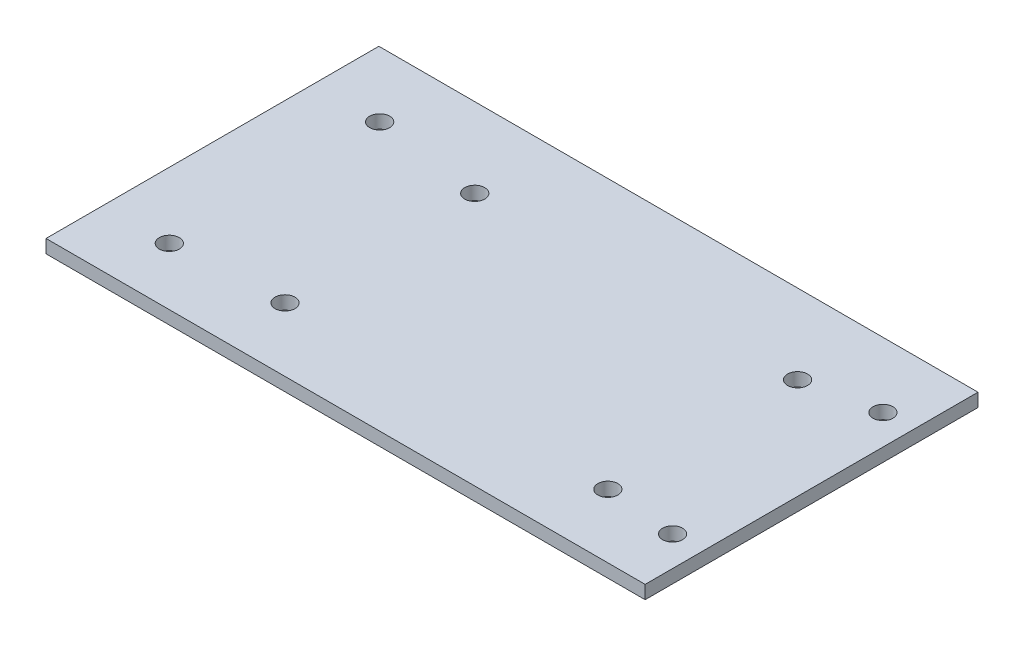
ISO-10303-21;
HEADER;
FILE_DESCRIPTION(('STEP AP214'),'2;1');
FILE_NAME('part.step','',(''),(''),'','','');
FILE_SCHEMA(('AUTOMOTIVE_DESIGN { 1 0 10303 214 1 1 1 1 }'));
ENDSEC;
DATA;
#1=APPLICATION_CONTEXT('core data for automotive mechanical design processes');
#2=APPLICATION_PROTOCOL_DEFINITION('international standard','automotive_design',2000,#1);
#3=PRODUCT_CONTEXT('',#1,'mechanical');
#4=PRODUCT('Part','Part','',(#3));
#5=PRODUCT_RELATED_PRODUCT_CATEGORY('part','',(#4));
#6=PRODUCT_DEFINITION_FORMATION('','',#4);
#7=PRODUCT_DEFINITION_CONTEXT('part definition',#1,'design');
#8=PRODUCT_DEFINITION('design','',#6,#7);
#9=PRODUCT_DEFINITION_SHAPE('','',#8);
#10=(LENGTH_UNIT() NAMED_UNIT(*) SI_UNIT(.MILLI.,.METRE.));
#11=(NAMED_UNIT(*) PLANE_ANGLE_UNIT() SI_UNIT($,.RADIAN.));
#12=(NAMED_UNIT(*) SI_UNIT($,.STERADIAN.) SOLID_ANGLE_UNIT());
#13=UNCERTAINTY_MEASURE_WITH_UNIT(LENGTH_MEASURE(1.E-05),#10,'distance_accuracy_value','');
#14=(GEOMETRIC_REPRESENTATION_CONTEXT(3) GLOBAL_UNCERTAINTY_ASSIGNED_CONTEXT((#13)) GLOBAL_UNIT_ASSIGNED_CONTEXT((#10,
#11,#12)) REPRESENTATION_CONTEXT('',''));
#15=CARTESIAN_POINT('',(0.,0.,0.));
#16=DIRECTION('',(0.,0.,1.));
#17=DIRECTION('',(1.,0.,0.));
#18=AXIS2_PLACEMENT_3D('',#15,#16,#17);
#19=CARTESIAN_POINT('',(0.,2.,0.));
#20=DIRECTION('',(0.,-1.,0.));
#21=DIRECTION('',(0.,0.,-1.));
#22=AXIS2_PLACEMENT_3D('',#19,#20,#21);
#23=PLANE('',#22);
#24=DIRECTION('',(0.,0.,1.));
#25=VECTOR('',#24,1.);
#26=CARTESIAN_POINT('',(0.,2.,0.));
#27=LINE('',#26,#25);
#28=CARTESIAN_POINT('',(0.,2.,-50.));
#29=VERTEX_POINT('',#28);
#30=CARTESIAN_POINT('',(0.,2.,0.));
#31=VERTEX_POINT('',#30);
#32=EDGE_CURVE('E92',#29,#31,#27,.T.);
#33=ORIENTED_EDGE('',*,*,#32,.T.);
#34=DIRECTION('',(1.,0.,0.));
#35=VECTOR('',#34,1.);
#36=CARTESIAN_POINT('',(0.,2.,0.));
#37=LINE('',#36,#35);
#38=CARTESIAN_POINT('',(90.,2.,0.));
#39=VERTEX_POINT('',#38);
#40=EDGE_CURVE('E87',#31,#39,#37,.T.);
#41=ORIENTED_EDGE('',*,*,#40,.T.);
#42=DIRECTION('',(0.,0.,-1.));
#43=VECTOR('',#42,1.);
#44=CARTESIAN_POINT('',(90.,2.,0.));
#45=LINE('',#44,#43);
#46=CARTESIAN_POINT('',(90.,2.,-50.));
#47=VERTEX_POINT('',#46);
#48=EDGE_CURVE('E90',#39,#47,#45,.T.);
#49=ORIENTED_EDGE('',*,*,#48,.T.);
#50=DIRECTION('',(-1.,0.,0.));
#51=VECTOR('',#50,1.);
#52=CARTESIAN_POINT('',(0.,2.,-50.));
#53=LINE('',#52,#51);
#54=EDGE_CURVE('E57',#47,#29,#53,.T.);
#55=ORIENTED_EDGE('',*,*,#54,.T.);
#56=EDGE_LOOP('',(#33,#41,#49,#55));
#57=FACE_BOUND('',#56,.T.);
#58=CARTESIAN_POINT('',(26.3346323435625,2.,-38.0676903986727));
#59=DIRECTION('',(0.,1.,0.));
#60=DIRECTION('',(0.,0.,1.));
#61=AXIS2_PLACEMENT_3D('',#58,#59,#60);
#62=CIRCLE('',#61,1.5);
#63=CARTESIAN_POINT('',(26.3346323435625,2.,-36.5676903986727));
#64=VERTEX_POINT('',#63);
#65=EDGE_CURVE('E112',#64,#64,#62,.T.);
#66=ORIENTED_EDGE('',*,*,#65,.F.);
#67=EDGE_LOOP('',(#66));
#68=FACE_BOUND('',#67,.T.);
#69=CARTESIAN_POINT('',(9.89940327190227,2.,-40.2217082499169));
#70=DIRECTION('',(0.,1.,0.));
#71=DIRECTION('',(0.,0.,1.));
#72=AXIS2_PLACEMENT_3D('',#69,#70,#71);
#73=CIRCLE('',#72,1.5);
#74=CARTESIAN_POINT('',(9.89940327190227,2.,-38.7217082499169));
#75=VERTEX_POINT('',#74);
#76=EDGE_CURVE('E134',#75,#75,#73,.T.);
#77=ORIENTED_EDGE('',*,*,#76,.F.);
#78=EDGE_LOOP('',(#77));
#79=FACE_BOUND('',#78,.T.);
#80=CARTESIAN_POINT('',(74.8346323435625,2.,-38.0676903986733));
#81=DIRECTION('',(0.,1.,0.));
#82=DIRECTION('',(0.,0.,1.));
#83=AXIS2_PLACEMENT_3D('',#80,#81,#82);
#84=CIRCLE('',#83,1.5);
#85=CARTESIAN_POINT('',(74.8346323435625,2.,-36.5676903986733));
#86=VERTEX_POINT('',#85);
#87=EDGE_CURVE('E142',#86,#86,#84,.T.);
#88=ORIENTED_EDGE('',*,*,#87,.F.);
#89=EDGE_LOOP('',(#88));
#90=FACE_BOUND('',#89,.T.);
#91=CARTESIAN_POINT('',(74.8346323435628,2.,-9.56769039867333));
#92=DIRECTION('',(0.,1.,0.));
#93=DIRECTION('',(0.,0.,1.));
#94=AXIS2_PLACEMENT_3D('',#91,#92,#93);
#95=CIRCLE('',#94,1.50000000000001);
#96=CARTESIAN_POINT('',(74.8346323435628,2.,-8.06769039867332));
#97=VERTEX_POINT('',#96);
#98=EDGE_CURVE('E150',#97,#97,#95,.T.);
#99=ORIENTED_EDGE('',*,*,#98,.F.);
#100=EDGE_LOOP('',(#99));
#101=FACE_BOUND('',#100,.T.);
#102=CARTESIAN_POINT('',(26.3346323435628,2.,-9.56769039867265));
#103=DIRECTION('',(0.,1.,0.));
#104=DIRECTION('',(0.,0.,1.));
#105=AXIS2_PLACEMENT_3D('',#102,#103,#104);
#106=CIRCLE('',#105,1.5);
#107=CARTESIAN_POINT('',(26.3346323435628,2.,-8.06769039867265));
#108=VERTEX_POINT('',#107);
#109=EDGE_CURVE('E158',#108,#108,#106,.T.);
#110=ORIENTED_EDGE('',*,*,#109,.F.);
#111=EDGE_LOOP('',(#110));
#112=FACE_BOUND('',#111,.T.);
#113=CARTESIAN_POINT('',(85.4994032719023,2.,-40.221708249918));
#114=DIRECTION('',(0.,1.,0.));
#115=DIRECTION('',(0.,0.,1.));
#116=AXIS2_PLACEMENT_3D('',#113,#114,#115);
#117=CIRCLE('',#116,1.5);
#118=CARTESIAN_POINT('',(85.4994032719023,2.,-38.721708249918));
#119=VERTEX_POINT('',#118);
#120=EDGE_CURVE('E166',#119,#119,#117,.T.);
#121=ORIENTED_EDGE('',*,*,#120,.F.);
#122=EDGE_LOOP('',(#121));
#123=FACE_BOUND('',#122,.T.);
#124=CARTESIAN_POINT('',(85.4994032719026,2.,-8.62170824991798));
#125=DIRECTION('',(0.,1.,0.));
#126=DIRECTION('',(0.,0.,1.));
#127=AXIS2_PLACEMENT_3D('',#124,#125,#126);
#128=CIRCLE('',#127,1.5);
#129=CARTESIAN_POINT('',(85.4994032719026,2.,-7.12170824991798));
#130=VERTEX_POINT('',#129);
#131=EDGE_CURVE('E174',#130,#130,#128,.T.);
#132=ORIENTED_EDGE('',*,*,#131,.F.);
#133=EDGE_LOOP('',(#132));
#134=FACE_BOUND('',#133,.T.);
#135=CARTESIAN_POINT('',(9.8994032719026,2.,-8.62170824991693));
#136=DIRECTION('',(0.,1.,0.));
#137=DIRECTION('',(0.,0.,1.));
#138=AXIS2_PLACEMENT_3D('',#135,#136,#137);
#139=CIRCLE('',#138,1.5);
#140=CARTESIAN_POINT('',(9.8994032719026,2.,-7.12170824991692));
#141=VERTEX_POINT('',#140);
#142=EDGE_CURVE('E182',#141,#141,#139,.T.);
#143=ORIENTED_EDGE('',*,*,#142,.F.);
#144=EDGE_LOOP('',(#143));
#145=FACE_BOUND('',#144,.T.);
#146=ADVANCED_FACE('F39',(#57,#68,#79,#90,#101,#112,#123,#134,#145),#23,.F.);
#147=CARTESIAN_POINT('',(0.,0.,0.));
#148=DIRECTION('',(0.,-1.,0.));
#149=DIRECTION('',(0.,0.,-1.));
#150=AXIS2_PLACEMENT_3D('',#147,#148,#149);
#151=PLANE('',#150);
#152=CARTESIAN_POINT('',(85.4994032719026,0.,-8.62170824991798));
#153=DIRECTION('',(0.,1.,0.));
#154=DIRECTION('',(0.,0.,1.));
#155=AXIS2_PLACEMENT_3D('',#152,#153,#154);
#156=CIRCLE('',#155,1.5);
#157=CARTESIAN_POINT('',(85.4994032719026,0.,-7.12170824991798));
#158=VERTEX_POINT('',#157);
#159=EDGE_CURVE('E178',#158,#158,#156,.T.);
#160=ORIENTED_EDGE('',*,*,#159,.T.);
#161=EDGE_LOOP('',(#160));
#162=FACE_BOUND('',#161,.T.);
#163=CARTESIAN_POINT('',(26.3346323435628,0.,-9.56769039867265));
#164=DIRECTION('',(0.,1.,0.));
#165=DIRECTION('',(0.,0.,1.));
#166=AXIS2_PLACEMENT_3D('',#163,#164,#165);
#167=CIRCLE('',#166,1.5);
#168=CARTESIAN_POINT('',(26.3346323435628,0.,-8.06769039867265));
#169=VERTEX_POINT('',#168);
#170=EDGE_CURVE('E162',#169,#169,#167,.T.);
#171=ORIENTED_EDGE('',*,*,#170,.T.);
#172=EDGE_LOOP('',(#171));
#173=FACE_BOUND('',#172,.T.);
#174=CARTESIAN_POINT('',(74.8346323435625,0.,-38.0676903986733));
#175=DIRECTION('',(0.,1.,0.));
#176=DIRECTION('',(0.,0.,1.));
#177=AXIS2_PLACEMENT_3D('',#174,#175,#176);
#178=CIRCLE('',#177,1.5);
#179=CARTESIAN_POINT('',(74.8346323435625,0.,-36.5676903986733));
#180=VERTEX_POINT('',#179);
#181=EDGE_CURVE('E146',#180,#180,#178,.T.);
#182=ORIENTED_EDGE('',*,*,#181,.T.);
#183=EDGE_LOOP('',(#182));
#184=FACE_BOUND('',#183,.T.);
#185=CARTESIAN_POINT('',(26.3346323435625,0.,-38.0676903986727));
#186=DIRECTION('',(0.,1.,0.));
#187=DIRECTION('',(0.,0.,1.));
#188=AXIS2_PLACEMENT_3D('',#185,#186,#187);
#189=CIRCLE('',#188,1.5);
#190=CARTESIAN_POINT('',(26.3346323435625,0.,-36.5676903986727));
#191=VERTEX_POINT('',#190);
#192=EDGE_CURVE('E130',#191,#191,#189,.T.);
#193=ORIENTED_EDGE('',*,*,#192,.T.);
#194=EDGE_LOOP('',(#193));
#195=FACE_BOUND('',#194,.T.);
#196=DIRECTION('',(0.,0.,1.));
#197=VECTOR('',#196,1.);
#198=CARTESIAN_POINT('',(0.,0.,0.));
#199=LINE('',#198,#197);
#200=CARTESIAN_POINT('',(0.,0.,-50.));
#201=VERTEX_POINT('',#200);
#202=CARTESIAN_POINT('',(0.,0.,0.));
#203=VERTEX_POINT('',#202);
#204=EDGE_CURVE('E108',#201,#203,#199,.T.);
#205=ORIENTED_EDGE('',*,*,#204,.F.);
#206=DIRECTION('',(-1.,0.,0.));
#207=VECTOR('',#206,1.);
#208=CARTESIAN_POINT('',(0.,0.,-50.));
#209=LINE('',#208,#207);
#210=CARTESIAN_POINT('',(90.,0.,-50.));
#211=VERTEX_POINT('',#210);
#212=EDGE_CURVE('E80',#211,#201,#209,.T.);
#213=ORIENTED_EDGE('',*,*,#212,.F.);
#214=DIRECTION('',(0.,0.,-1.));
#215=VECTOR('',#214,1.);
#216=CARTESIAN_POINT('',(90.,0.,0.));
#217=LINE('',#216,#215);
#218=CARTESIAN_POINT('',(90.,0.,0.));
#219=VERTEX_POINT('',#218);
#220=EDGE_CURVE('E74',#219,#211,#217,.T.);
#221=ORIENTED_EDGE('',*,*,#220,.F.);
#222=DIRECTION('',(1.,0.,0.));
#223=VECTOR('',#222,1.);
#224=CARTESIAN_POINT('',(0.,0.,0.));
#225=LINE('',#224,#223);
#226=EDGE_CURVE('E97',#203,#219,#225,.T.);
#227=ORIENTED_EDGE('',*,*,#226,.F.);
#228=EDGE_LOOP('',(#205,#213,#221,#227));
#229=FACE_BOUND('',#228,.T.);
#230=CARTESIAN_POINT('',(9.89940327190227,0.,-40.2217082499169));
#231=DIRECTION('',(0.,1.,0.));
#232=DIRECTION('',(0.,0.,1.));
#233=AXIS2_PLACEMENT_3D('',#230,#231,#232);
#234=CIRCLE('',#233,1.5);
#235=CARTESIAN_POINT('',(9.89940327190227,0.,-38.7217082499169));
#236=VERTEX_POINT('',#235);
#237=EDGE_CURVE('E138',#236,#236,#234,.T.);
#238=ORIENTED_EDGE('',*,*,#237,.T.);
#239=EDGE_LOOP('',(#238));
#240=FACE_BOUND('',#239,.T.);
#241=CARTESIAN_POINT('',(74.8346323435628,0.,-9.56769039867333));
#242=DIRECTION('',(0.,1.,0.));
#243=DIRECTION('',(0.,0.,1.));
#244=AXIS2_PLACEMENT_3D('',#241,#242,#243);
#245=CIRCLE('',#244,1.50000000000001);
#246=CARTESIAN_POINT('',(74.8346323435628,0.,-8.06769039867332));
#247=VERTEX_POINT('',#246);
#248=EDGE_CURVE('E154',#247,#247,#245,.T.);
#249=ORIENTED_EDGE('',*,*,#248,.T.);
#250=EDGE_LOOP('',(#249));
#251=FACE_BOUND('',#250,.T.);
#252=CARTESIAN_POINT('',(85.4994032719023,0.,-40.221708249918));
#253=DIRECTION('',(0.,1.,0.));
#254=DIRECTION('',(0.,0.,1.));
#255=AXIS2_PLACEMENT_3D('',#252,#253,#254);
#256=CIRCLE('',#255,1.5);
#257=CARTESIAN_POINT('',(85.4994032719023,0.,-38.721708249918));
#258=VERTEX_POINT('',#257);
#259=EDGE_CURVE('E170',#258,#258,#256,.T.);
#260=ORIENTED_EDGE('',*,*,#259,.T.);
#261=EDGE_LOOP('',(#260));
#262=FACE_BOUND('',#261,.T.);
#263=CARTESIAN_POINT('',(9.8994032719026,0.,-8.62170824991693));
#264=DIRECTION('',(0.,1.,0.));
#265=DIRECTION('',(0.,0.,1.));
#266=AXIS2_PLACEMENT_3D('',#263,#264,#265);
#267=CIRCLE('',#266,1.5);
#268=CARTESIAN_POINT('',(9.8994032719026,0.,-7.12170824991692));
#269=VERTEX_POINT('',#268);
#270=EDGE_CURVE('E186',#269,#269,#267,.T.);
#271=ORIENTED_EDGE('',*,*,#270,.T.);
#272=EDGE_LOOP('',(#271));
#273=FACE_BOUND('',#272,.T.);
#274=ADVANCED_FACE('F125',(#162,#173,#184,#195,#229,#240,#251,#262,#273),#151,.T.);
#275=CARTESIAN_POINT('',(0.,2.,0.));
#276=DIRECTION('',(1.,0.,0.));
#277=DIRECTION('',(0.,0.,-1.));
#278=AXIS2_PLACEMENT_3D('',#275,#276,#277);
#279=PLANE('',#278);
#280=ORIENTED_EDGE('',*,*,#204,.T.);
#281=DIRECTION('',(0.,-1.,0.));
#282=VECTOR('',#281,1.);
#283=CARTESIAN_POINT('',(0.,2.,0.));
#284=LINE('',#283,#282);
#285=EDGE_CURVE('E11',#31,#203,#284,.T.);
#286=ORIENTED_EDGE('',*,*,#285,.F.);
#287=ORIENTED_EDGE('',*,*,#32,.F.);
#288=DIRECTION('',(0.,-1.,0.));
#289=VECTOR('',#288,1.);
#290=CARTESIAN_POINT('',(0.,2.,-50.));
#291=LINE('',#290,#289);
#292=EDGE_CURVE('E104',#29,#201,#291,.T.);
#293=ORIENTED_EDGE('',*,*,#292,.T.);
#294=EDGE_LOOP('',(#280,#286,#287,#293));
#295=FACE_BOUND('',#294,.T.);
#296=ADVANCED_FACE('F41',(#295),#279,.F.);
#297=CARTESIAN_POINT('',(0.,2.,0.));
#298=DIRECTION('',(0.,0.,-1.));
#299=DIRECTION('',(-1.,0.,0.));
#300=AXIS2_PLACEMENT_3D('',#297,#298,#299);
#301=PLANE('',#300);
#302=ORIENTED_EDGE('',*,*,#226,.T.);
#303=DIRECTION('',(0.,-1.,0.));
#304=VECTOR('',#303,1.);
#305=CARTESIAN_POINT('',(90.,2.,0.));
#306=LINE('',#305,#304);
#307=EDGE_CURVE('E49',#39,#219,#306,.T.);
#308=ORIENTED_EDGE('',*,*,#307,.F.);
#309=ORIENTED_EDGE('',*,*,#40,.F.);
#310=ORIENTED_EDGE('',*,*,#285,.T.);
#311=EDGE_LOOP('',(#302,#308,#309,#310));
#312=FACE_BOUND('',#311,.T.);
#313=ADVANCED_FACE('F96',(#312),#301,.F.);
#314=CARTESIAN_POINT('',(90.,2.,0.));
#315=DIRECTION('',(-1.,0.,0.));
#316=DIRECTION('',(0.,0.,1.));
#317=AXIS2_PLACEMENT_3D('',#314,#315,#316);
#318=PLANE('',#317);
#319=ORIENTED_EDGE('',*,*,#220,.T.);
#320=DIRECTION('',(0.,-1.,0.));
#321=VECTOR('',#320,1.);
#322=CARTESIAN_POINT('',(90.,2.,-50.));
#323=LINE('',#322,#321);
#324=EDGE_CURVE('E99',#47,#211,#323,.T.);
#325=ORIENTED_EDGE('',*,*,#324,.F.);
#326=ORIENTED_EDGE('',*,*,#48,.F.);
#327=ORIENTED_EDGE('',*,*,#307,.T.);
#328=EDGE_LOOP('',(#319,#325,#326,#327));
#329=FACE_BOUND('',#328,.T.);
#330=ADVANCED_FACE('F100',(#329),#318,.F.);
#331=CARTESIAN_POINT('',(0.,2.,-50.));
#332=DIRECTION('',(0.,0.,1.));
#333=DIRECTION('',(1.,0.,0.));
#334=AXIS2_PLACEMENT_3D('',#331,#332,#333);
#335=PLANE('',#334);
#336=ORIENTED_EDGE('',*,*,#212,.T.);
#337=ORIENTED_EDGE('',*,*,#292,.F.);
#338=ORIENTED_EDGE('',*,*,#54,.F.);
#339=ORIENTED_EDGE('',*,*,#324,.T.);
#340=EDGE_LOOP('',(#336,#337,#338,#339));
#341=FACE_BOUND('',#340,.T.);
#342=ADVANCED_FACE('F122',(#341),#335,.F.);
#343=CARTESIAN_POINT('',(26.3346323435625,2.,-38.0676903986727));
#344=DIRECTION('',(0.,-1.,0.));
#345=DIRECTION('',(0.,0.,-1.));
#346=AXIS2_PLACEMENT_3D('',#343,#344,#345);
#347=CYLINDRICAL_SURFACE('',#346,1.5);
#348=ORIENTED_EDGE('',*,*,#65,.T.);
#349=EDGE_LOOP('',(#348));
#350=FACE_BOUND('',#349,.T.);
#351=ORIENTED_EDGE('',*,*,#192,.F.);
#352=EDGE_LOOP('',(#351));
#353=FACE_BOUND('',#352,.T.);
#354=ADVANCED_FACE('F205',(#350,#353),#347,.F.);
#355=CARTESIAN_POINT('',(9.89940327190227,2.,-40.2217082499169));
#356=DIRECTION('',(0.,-1.,0.));
#357=DIRECTION('',(0.,0.,-1.));
#358=AXIS2_PLACEMENT_3D('',#355,#356,#357);
#359=CYLINDRICAL_SURFACE('',#358,1.5);
#360=ORIENTED_EDGE('',*,*,#76,.T.);
#361=EDGE_LOOP('',(#360));
#362=FACE_BOUND('',#361,.T.);
#363=ORIENTED_EDGE('',*,*,#237,.F.);
#364=EDGE_LOOP('',(#363));
#365=FACE_BOUND('',#364,.T.);
#366=ADVANCED_FACE('F251',(#362,#365),#359,.F.);
#367=CARTESIAN_POINT('',(74.8346323435625,2.,-38.0676903986733));
#368=DIRECTION('',(0.,-1.,0.));
#369=DIRECTION('',(0.,0.,-1.));
#370=AXIS2_PLACEMENT_3D('',#367,#368,#369);
#371=CYLINDRICAL_SURFACE('',#370,1.5);
#372=ORIENTED_EDGE('',*,*,#87,.T.);
#373=EDGE_LOOP('',(#372));
#374=FACE_BOUND('',#373,.T.);
#375=ORIENTED_EDGE('',*,*,#181,.F.);
#376=EDGE_LOOP('',(#375));
#377=FACE_BOUND('',#376,.T.);
#378=ADVANCED_FACE('F259',(#374,#377),#371,.F.);
#379=CARTESIAN_POINT('',(74.8346323435628,2.,-9.56769039867333));
#380=DIRECTION('',(0.,-1.,0.));
#381=DIRECTION('',(0.,0.,-1.));
#382=AXIS2_PLACEMENT_3D('',#379,#380,#381);
#383=CYLINDRICAL_SURFACE('',#382,1.50000000000001);
#384=ORIENTED_EDGE('',*,*,#98,.T.);
#385=EDGE_LOOP('',(#384));
#386=FACE_BOUND('',#385,.T.);
#387=ORIENTED_EDGE('',*,*,#248,.F.);
#388=EDGE_LOOP('',(#387));
#389=FACE_BOUND('',#388,.T.);
#390=ADVANCED_FACE('F267',(#386,#389),#383,.F.);
#391=CARTESIAN_POINT('',(26.3346323435628,2.,-9.56769039867265));
#392=DIRECTION('',(0.,-1.,0.));
#393=DIRECTION('',(0.,0.,-1.));
#394=AXIS2_PLACEMENT_3D('',#391,#392,#393);
#395=CYLINDRICAL_SURFACE('',#394,1.5);
#396=ORIENTED_EDGE('',*,*,#109,.T.);
#397=EDGE_LOOP('',(#396));
#398=FACE_BOUND('',#397,.T.);
#399=ORIENTED_EDGE('',*,*,#170,.F.);
#400=EDGE_LOOP('',(#399));
#401=FACE_BOUND('',#400,.T.);
#402=ADVANCED_FACE('F276',(#398,#401),#395,.F.);
#403=CARTESIAN_POINT('',(85.4994032719023,2.,-40.221708249918));
#404=DIRECTION('',(0.,-1.,0.));
#405=DIRECTION('',(0.,0.,-1.));
#406=AXIS2_PLACEMENT_3D('',#403,#404,#405);
#407=CYLINDRICAL_SURFACE('',#406,1.5);
#408=ORIENTED_EDGE('',*,*,#120,.T.);
#409=EDGE_LOOP('',(#408));
#410=FACE_BOUND('',#409,.T.);
#411=ORIENTED_EDGE('',*,*,#259,.F.);
#412=EDGE_LOOP('',(#411));
#413=FACE_BOUND('',#412,.T.);
#414=ADVANCED_FACE('F285',(#410,#413),#407,.F.);
#415=CARTESIAN_POINT('',(85.4994032719026,2.,-8.62170824991798));
#416=DIRECTION('',(0.,-1.,0.));
#417=DIRECTION('',(0.,0.,-1.));
#418=AXIS2_PLACEMENT_3D('',#415,#416,#417);
#419=CYLINDRICAL_SURFACE('',#418,1.5);
#420=ORIENTED_EDGE('',*,*,#131,.T.);
#421=EDGE_LOOP('',(#420));
#422=FACE_BOUND('',#421,.T.);
#423=ORIENTED_EDGE('',*,*,#159,.F.);
#424=EDGE_LOOP('',(#423));
#425=FACE_BOUND('',#424,.T.);
#426=ADVANCED_FACE('F294',(#422,#425),#419,.F.);
#427=CARTESIAN_POINT('',(9.8994032719026,2.,-8.62170824991693));
#428=DIRECTION('',(0.,-1.,0.));
#429=DIRECTION('',(0.,0.,-1.));
#430=AXIS2_PLACEMENT_3D('',#427,#428,#429);
#431=CYLINDRICAL_SURFACE('',#430,1.5);
#432=ORIENTED_EDGE('',*,*,#142,.T.);
#433=EDGE_LOOP('',(#432));
#434=FACE_BOUND('',#433,.T.);
#435=ORIENTED_EDGE('',*,*,#270,.F.);
#436=EDGE_LOOP('',(#435));
#437=FACE_BOUND('',#436,.T.);
#438=ADVANCED_FACE('F194',(#434,#437),#431,.F.);
#439=CLOSED_SHELL('',(#146,#274,#296,#313,#330,#342,#354,#366,#378,#390,#402,#414,#426,#438));
#440=MANIFOLD_SOLID_BREP('B2',#439);
#441=ADVANCED_BREP_SHAPE_REPRESENTATION('',(#18,#440),#14);
#442=SHAPE_DEFINITION_REPRESENTATION(#9,#441);
ENDSEC;
END-ISO-10303-21;
